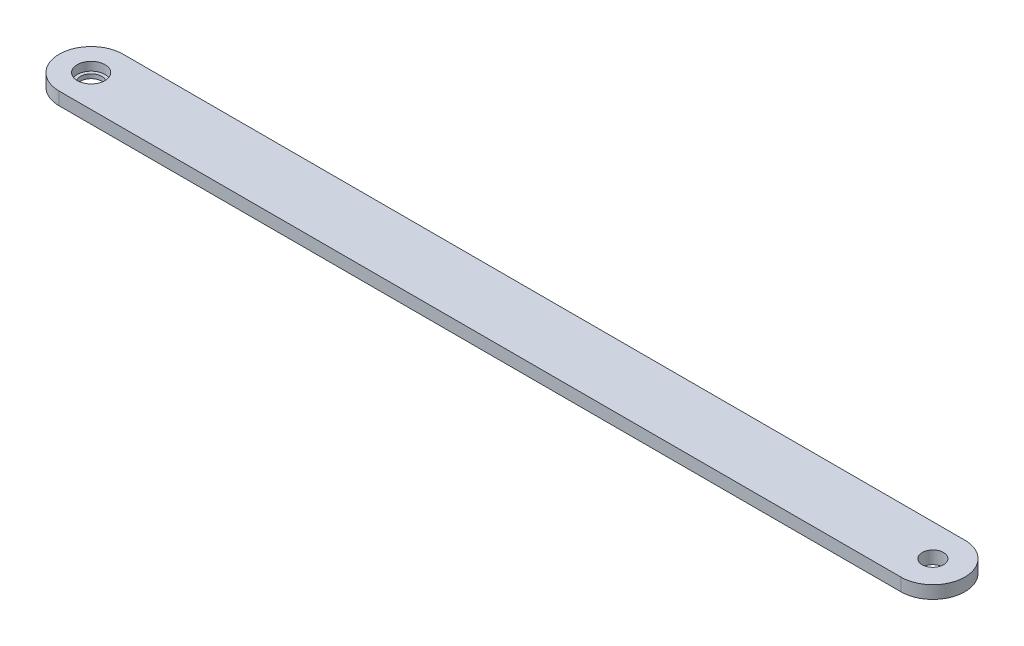
ISO-10303-21;
HEADER;
FILE_DESCRIPTION(('STEP AP214'),'2;1');
FILE_NAME('part.step','',(''),(''),'','','');
FILE_SCHEMA(('AUTOMOTIVE_DESIGN { 1 0 10303 214 1 1 1 1 }'));
ENDSEC;
DATA;
#1=APPLICATION_CONTEXT('core data for automotive mechanical design processes');
#2=APPLICATION_PROTOCOL_DEFINITION('international standard','automotive_design',2000,#1);
#3=PRODUCT_CONTEXT('',#1,'mechanical');
#4=PRODUCT('Part','Part','',(#3));
#5=PRODUCT_RELATED_PRODUCT_CATEGORY('part','',(#4));
#6=PRODUCT_DEFINITION_FORMATION('','',#4);
#7=PRODUCT_DEFINITION_CONTEXT('part definition',#1,'design');
#8=PRODUCT_DEFINITION('design','',#6,#7);
#9=PRODUCT_DEFINITION_SHAPE('','',#8);
#10=(LENGTH_UNIT() NAMED_UNIT(*) SI_UNIT(.MILLI.,.METRE.));
#11=(NAMED_UNIT(*) PLANE_ANGLE_UNIT() SI_UNIT($,.RADIAN.));
#12=(NAMED_UNIT(*) SI_UNIT($,.STERADIAN.) SOLID_ANGLE_UNIT());
#13=UNCERTAINTY_MEASURE_WITH_UNIT(LENGTH_MEASURE(1.E-05),#10,'distance_accuracy_value','');
#14=(GEOMETRIC_REPRESENTATION_CONTEXT(3) GLOBAL_UNCERTAINTY_ASSIGNED_CONTEXT((#13)) GLOBAL_UNIT_ASSIGNED_CONTEXT((#10,
#11,#12)) REPRESENTATION_CONTEXT('',''));
#15=CARTESIAN_POINT('',(0.,0.,0.));
#16=DIRECTION('',(0.,0.,1.));
#17=DIRECTION('',(1.,0.,0.));
#18=AXIS2_PLACEMENT_3D('',#15,#16,#17);
#19=CARTESIAN_POINT('',(-45.,6.,0.));
#20=DIRECTION('',(0.,-1.,0.));
#21=DIRECTION('',(0.,0.,-1.));
#22=AXIS2_PLACEMENT_3D('',#19,#20,#21);
#23=CYLINDRICAL_SURFACE('',#22,5.);
#24=CARTESIAN_POINT('',(-45.,0.,0.));
#25=DIRECTION('',(0.,1.,0.));
#26=DIRECTION('',(0.,0.,1.));
#27=AXIS2_PLACEMENT_3D('',#24,#25,#26);
#28=CIRCLE('',#27,5.);
#29=CARTESIAN_POINT('',(-45.,0.,5.));
#30=VERTEX_POINT('',#29);
#31=EDGE_CURVE('E115',#30,#30,#28,.T.);
#32=ORIENTED_EDGE('',*,*,#31,.F.);
#33=EDGE_LOOP('',(#32));
#34=FACE_BOUND('',#33,.T.);
#35=CARTESIAN_POINT('',(-45.,2.,0.));
#36=DIRECTION('',(0.,1.,0.));
#37=DIRECTION('',(0.,0.,1.));
#38=AXIS2_PLACEMENT_3D('',#35,#36,#37);
#39=CIRCLE('',#38,5.);
#40=CARTESIAN_POINT('',(-45.,2.,5.));
#41=VERTEX_POINT('',#40);
#42=EDGE_CURVE('E43',#41,#41,#39,.T.);
#43=ORIENTED_EDGE('',*,*,#42,.T.);
#44=EDGE_LOOP('',(#43));
#45=FACE_BOUND('',#44,.T.);
#46=ADVANCED_FACE('F39',(#34,#45),#23,.F.);
#47=CARTESIAN_POINT('',(350.,6.,0.));
#48=DIRECTION('',(0.,1.,0.));
#49=DIRECTION('',(0.,0.,1.));
#50=AXIS2_PLACEMENT_3D('',#47,#48,#49);
#51=PLANE('',#50);
#52=CARTESIAN_POINT('',(-45.,6.,0.));
#53=DIRECTION('',(0.,1.,0.));
#54=DIRECTION('',(0.,0.,1.));
#55=AXIS2_PLACEMENT_3D('',#52,#53,#54);
#56=CIRCLE('',#55,6.5);
#57=CARTESIAN_POINT('',(-45.,6.,6.5));
#58=VERTEX_POINT('',#57);
#59=EDGE_CURVE('E144',#58,#58,#56,.T.);
#60=ORIENTED_EDGE('',*,*,#59,.F.);
#61=EDGE_LOOP('',(#60));
#62=FACE_BOUND('',#61,.T.);
#63=CARTESIAN_POINT('',(350.,6.,0.));
#64=DIRECTION('',(0.,1.,0.));
#65=DIRECTION('',(0.,0.,1.));
#66=AXIS2_PLACEMENT_3D('',#63,#64,#65);
#67=CIRCLE('',#66,15.);
#68=CARTESIAN_POINT('',(350.,6.,15.));
#69=VERTEX_POINT('',#68);
#70=CARTESIAN_POINT('',(350.,6.,-15.));
#71=VERTEX_POINT('',#70);
#72=EDGE_CURVE('E94',#69,#71,#67,.T.);
#73=ORIENTED_EDGE('',*,*,#72,.T.);
#74=DIRECTION('',(-1.,0.,0.));
#75=VECTOR('',#74,1.);
#76=CARTESIAN_POINT('',(-45.,6.,-15.));
#77=LINE('',#76,#75);
#78=CARTESIAN_POINT('',(-45.,6.,-15.));
#79=VERTEX_POINT('',#78);
#80=EDGE_CURVE('E88',#71,#79,#77,.T.);
#81=ORIENTED_EDGE('',*,*,#80,.T.);
#82=CARTESIAN_POINT('',(-45.,6.,0.));
#83=DIRECTION('',(0.,1.,0.));
#84=DIRECTION('',(0.,0.,1.));
#85=AXIS2_PLACEMENT_3D('',#82,#83,#84);
#86=CIRCLE('',#85,15.);
#87=CARTESIAN_POINT('',(-45.,6.,15.));
#88=VERTEX_POINT('',#87);
#89=EDGE_CURVE('E92',#79,#88,#86,.T.);
#90=ORIENTED_EDGE('',*,*,#89,.T.);
#91=DIRECTION('',(1.,0.,0.));
#92=VECTOR('',#91,1.);
#93=CARTESIAN_POINT('',(-45.,6.,15.));
#94=LINE('',#93,#92);
#95=EDGE_CURVE('E58',#88,#69,#94,.T.);
#96=ORIENTED_EDGE('',*,*,#95,.T.);
#97=EDGE_LOOP('',(#73,#81,#90,#96));
#98=FACE_BOUND('',#97,.T.);
#99=CARTESIAN_POINT('',(350.,6.,0.));
#100=DIRECTION('',(0.,1.,0.));
#101=DIRECTION('',(0.,0.,1.));
#102=AXIS2_PLACEMENT_3D('',#99,#100,#101);
#103=CIRCLE('',#102,4.99999999999999);
#104=CARTESIAN_POINT('',(350.,6.,4.99999999999999));
#105=VERTEX_POINT('',#104);
#106=EDGE_CURVE('E136',#105,#105,#103,.T.);
#107=ORIENTED_EDGE('',*,*,#106,.F.);
#108=EDGE_LOOP('',(#107));
#109=FACE_BOUND('',#108,.T.);
#110=ADVANCED_FACE('F89',(#62,#98,#109),#51,.T.);
#111=CARTESIAN_POINT('',(350.,0.,0.));
#112=DIRECTION('',(0.,1.,0.));
#113=DIRECTION('',(0.,0.,1.));
#114=AXIS2_PLACEMENT_3D('',#111,#112,#113);
#115=PLANE('',#114);
#116=CARTESIAN_POINT('',(350.,0.,0.));
#117=DIRECTION('',(0.,1.,0.));
#118=DIRECTION('',(0.,0.,1.));
#119=AXIS2_PLACEMENT_3D('',#116,#117,#118);
#120=CIRCLE('',#119,15.);
#121=CARTESIAN_POINT('',(350.,0.,15.));
#122=VERTEX_POINT('',#121);
#123=CARTESIAN_POINT('',(350.,0.,-15.));
#124=VERTEX_POINT('',#123);
#125=EDGE_CURVE('E111',#122,#124,#120,.T.);
#126=ORIENTED_EDGE('',*,*,#125,.F.);
#127=DIRECTION('',(1.,0.,0.));
#128=VECTOR('',#127,1.);
#129=CARTESIAN_POINT('',(-45.,0.,15.));
#130=LINE('',#129,#128);
#131=CARTESIAN_POINT('',(-45.,0.,15.));
#132=VERTEX_POINT('',#131);
#133=EDGE_CURVE('E81',#132,#122,#130,.T.);
#134=ORIENTED_EDGE('',*,*,#133,.F.);
#135=CARTESIAN_POINT('',(-45.,0.,0.));
#136=DIRECTION('',(0.,1.,0.));
#137=DIRECTION('',(0.,0.,1.));
#138=AXIS2_PLACEMENT_3D('',#135,#136,#137);
#139=CIRCLE('',#138,15.);
#140=CARTESIAN_POINT('',(-45.,0.,-15.));
#141=VERTEX_POINT('',#140);
#142=EDGE_CURVE('E75',#141,#132,#139,.T.);
#143=ORIENTED_EDGE('',*,*,#142,.F.);
#144=DIRECTION('',(-1.,0.,0.));
#145=VECTOR('',#144,1.);
#146=CARTESIAN_POINT('',(-45.,0.,-15.));
#147=LINE('',#146,#145);
#148=EDGE_CURVE('E99',#124,#141,#147,.T.);
#149=ORIENTED_EDGE('',*,*,#148,.F.);
#150=EDGE_LOOP('',(#126,#134,#143,#149));
#151=FACE_BOUND('',#150,.T.);
#152=ORIENTED_EDGE('',*,*,#31,.T.);
#153=EDGE_LOOP('',(#152));
#154=FACE_BOUND('',#153,.T.);
#155=CARTESIAN_POINT('',(350.,0.,0.));
#156=DIRECTION('',(0.,1.,0.));
#157=DIRECTION('',(0.,0.,1.));
#158=AXIS2_PLACEMENT_3D('',#155,#156,#157);
#159=CIRCLE('',#158,4.99999999999999);
#160=CARTESIAN_POINT('',(350.,0.,4.99999999999999));
#161=VERTEX_POINT('',#160);
#162=EDGE_CURVE('E137',#161,#161,#159,.T.);
#163=ORIENTED_EDGE('',*,*,#162,.T.);
#164=EDGE_LOOP('',(#163));
#165=FACE_BOUND('',#164,.T.);
#166=ADVANCED_FACE('F128',(#151,#154,#165),#115,.F.);
#167=CARTESIAN_POINT('',(350.,6.,0.));
#168=DIRECTION('',(0.,-1.,0.));
#169=DIRECTION('',(0.,0.,-1.));
#170=AXIS2_PLACEMENT_3D('',#167,#168,#169);
#171=CYLINDRICAL_SURFACE('',#170,15.);
#172=ORIENTED_EDGE('',*,*,#125,.T.);
#173=DIRECTION('',(0.,-1.,0.));
#174=VECTOR('',#173,1.);
#175=CARTESIAN_POINT('',(350.,6.,-15.));
#176=LINE('',#175,#174);
#177=EDGE_CURVE('E11',#71,#124,#176,.T.);
#178=ORIENTED_EDGE('',*,*,#177,.F.);
#179=ORIENTED_EDGE('',*,*,#72,.F.);
#180=DIRECTION('',(0.,-1.,0.));
#181=VECTOR('',#180,1.);
#182=CARTESIAN_POINT('',(350.,6.,15.));
#183=LINE('',#182,#181);
#184=EDGE_CURVE('E107',#69,#122,#183,.T.);
#185=ORIENTED_EDGE('',*,*,#184,.T.);
#186=EDGE_LOOP('',(#172,#178,#179,#185));
#187=FACE_BOUND('',#186,.T.);
#188=ADVANCED_FACE('F41',(#187),#171,.T.);
#189=CARTESIAN_POINT('',(-45.,6.,-15.));
#190=DIRECTION('',(0.,0.,1.));
#191=DIRECTION('',(1.,0.,0.));
#192=AXIS2_PLACEMENT_3D('',#189,#190,#191);
#193=PLANE('',#192);
#194=ORIENTED_EDGE('',*,*,#148,.T.);
#195=DIRECTION('',(0.,-1.,0.));
#196=VECTOR('',#195,1.);
#197=CARTESIAN_POINT('',(-45.,6.,-15.));
#198=LINE('',#197,#196);
#199=EDGE_CURVE('E50',#79,#141,#198,.T.);
#200=ORIENTED_EDGE('',*,*,#199,.F.);
#201=ORIENTED_EDGE('',*,*,#80,.F.);
#202=ORIENTED_EDGE('',*,*,#177,.T.);
#203=EDGE_LOOP('',(#194,#200,#201,#202));
#204=FACE_BOUND('',#203,.T.);
#205=ADVANCED_FACE('F98',(#204),#193,.F.);
#206=CARTESIAN_POINT('',(-45.,6.,0.));
#207=DIRECTION('',(0.,-1.,0.));
#208=DIRECTION('',(0.,0.,-1.));
#209=AXIS2_PLACEMENT_3D('',#206,#207,#208);
#210=CYLINDRICAL_SURFACE('',#209,15.);
#211=ORIENTED_EDGE('',*,*,#142,.T.);
#212=DIRECTION('',(0.,-1.,0.));
#213=VECTOR('',#212,1.);
#214=CARTESIAN_POINT('',(-45.,6.,15.));
#215=LINE('',#214,#213);
#216=EDGE_CURVE('E101',#88,#132,#215,.T.);
#217=ORIENTED_EDGE('',*,*,#216,.F.);
#218=ORIENTED_EDGE('',*,*,#89,.F.);
#219=ORIENTED_EDGE('',*,*,#199,.T.);
#220=EDGE_LOOP('',(#211,#217,#218,#219));
#221=FACE_BOUND('',#220,.T.);
#222=ADVANCED_FACE('F103',(#221),#210,.T.);
#223=CARTESIAN_POINT('',(-45.,6.,15.));
#224=DIRECTION('',(0.,0.,-1.));
#225=DIRECTION('',(-1.,0.,0.));
#226=AXIS2_PLACEMENT_3D('',#223,#224,#225);
#227=PLANE('',#226);
#228=ORIENTED_EDGE('',*,*,#133,.T.);
#229=ORIENTED_EDGE('',*,*,#184,.F.);
#230=ORIENTED_EDGE('',*,*,#95,.F.);
#231=ORIENTED_EDGE('',*,*,#216,.T.);
#232=EDGE_LOOP('',(#228,#229,#230,#231));
#233=FACE_BOUND('',#232,.T.);
#234=ADVANCED_FACE('F125',(#233),#227,.F.);
#235=CARTESIAN_POINT('',(350.,6.,0.));
#236=DIRECTION('',(0.,-1.,0.));
#237=DIRECTION('',(0.,0.,-1.));
#238=AXIS2_PLACEMENT_3D('',#235,#236,#237);
#239=CYLINDRICAL_SURFACE('',#238,4.99999999999999);
#240=ORIENTED_EDGE('',*,*,#106,.T.);
#241=EDGE_LOOP('',(#240));
#242=FACE_BOUND('',#241,.T.);
#243=ORIENTED_EDGE('',*,*,#162,.F.);
#244=EDGE_LOOP('',(#243));
#245=FACE_BOUND('',#244,.T.);
#246=ADVANCED_FACE('F165',(#242,#245),#239,.F.);
#247=CARTESIAN_POINT('',(-45.,2.,0.));
#248=DIRECTION('',(0.,1.,0.));
#249=DIRECTION('',(0.,0.,1.));
#250=AXIS2_PLACEMENT_3D('',#247,#248,#249);
#251=CYLINDRICAL_SURFACE('',#250,6.5);
#252=CARTESIAN_POINT('',(-45.,2.,0.));
#253=DIRECTION('',(0.,1.,0.));
#254=DIRECTION('',(0.,0.,1.));
#255=AXIS2_PLACEMENT_3D('',#252,#253,#254);
#256=CIRCLE('',#255,6.5);
#257=CARTESIAN_POINT('',(-45.,2.,6.5));
#258=VERTEX_POINT('',#257);
#259=EDGE_CURVE('E148',#258,#258,#256,.T.);
#260=ORIENTED_EDGE('',*,*,#259,.F.);
#261=EDGE_LOOP('',(#260));
#262=FACE_BOUND('',#261,.T.);
#263=ORIENTED_EDGE('',*,*,#59,.T.);
#264=EDGE_LOOP('',(#263));
#265=FACE_BOUND('',#264,.T.);
#266=ADVANCED_FACE('F160',(#262,#265),#251,.F.);
#267=CARTESIAN_POINT('',(-45.,2.,0.));
#268=DIRECTION('',(0.,1.,0.));
#269=DIRECTION('',(0.,0.,1.));
#270=AXIS2_PLACEMENT_3D('',#267,#268,#269);
#271=PLANE('',#270);
#272=ORIENTED_EDGE('',*,*,#42,.F.);
#273=EDGE_LOOP('',(#272));
#274=FACE_BOUND('',#273,.T.);
#275=ORIENTED_EDGE('',*,*,#259,.T.);
#276=EDGE_LOOP('',(#275));
#277=FACE_BOUND('',#276,.T.);
#278=ADVANCED_FACE('F158',(#274,#277),#271,.T.);
#279=CLOSED_SHELL('',(#46,#110,#166,#188,#205,#222,#234,#246,#266,#278));
#280=MANIFOLD_SOLID_BREP('B2',#279);
#281=ADVANCED_BREP_SHAPE_REPRESENTATION('',(#18,#280),#14);
#282=SHAPE_DEFINITION_REPRESENTATION(#9,#281);
ENDSEC;
END-ISO-10303-21;
